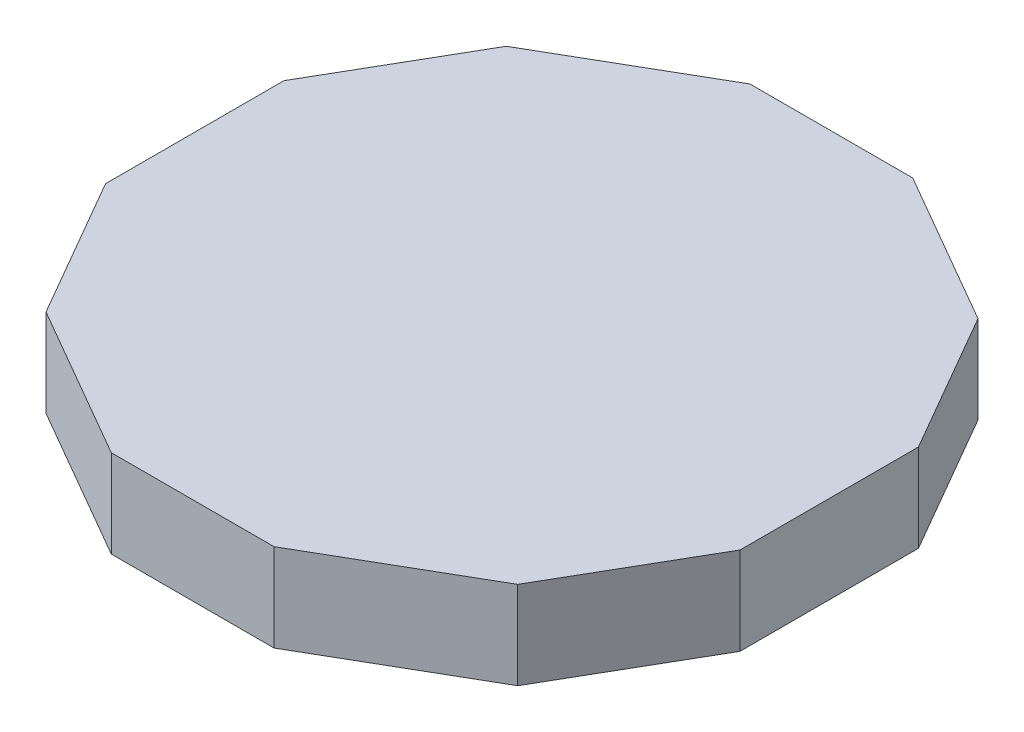
ISO-10303-21;
HEADER;
FILE_DESCRIPTION(('STEP AP214'),'2;1');
FILE_NAME('part.step','',(''),(''),'','','');
FILE_SCHEMA(('AUTOMOTIVE_DESIGN { 1 0 10303 214 1 1 1 1 }'));
ENDSEC;
DATA;
#1=APPLICATION_CONTEXT('core data for automotive mechanical design processes');
#2=APPLICATION_PROTOCOL_DEFINITION('international standard','automotive_design',2000,#1);
#3=PRODUCT_CONTEXT('',#1,'mechanical');
#4=PRODUCT('Part','Part','',(#3));
#5=PRODUCT_RELATED_PRODUCT_CATEGORY('part','',(#4));
#6=PRODUCT_DEFINITION_FORMATION('','',#4);
#7=PRODUCT_DEFINITION_CONTEXT('part definition',#1,'design');
#8=PRODUCT_DEFINITION('design','',#6,#7);
#9=PRODUCT_DEFINITION_SHAPE('','',#8);
#10=(LENGTH_UNIT() NAMED_UNIT(*) SI_UNIT(.MILLI.,.METRE.));
#11=(NAMED_UNIT(*) PLANE_ANGLE_UNIT() SI_UNIT($,.RADIAN.));
#12=(NAMED_UNIT(*) SI_UNIT($,.STERADIAN.) SOLID_ANGLE_UNIT());
#13=UNCERTAINTY_MEASURE_WITH_UNIT(LENGTH_MEASURE(1.E-05),#10,'distance_accuracy_value','');
#14=(GEOMETRIC_REPRESENTATION_CONTEXT(3) GLOBAL_UNCERTAINTY_ASSIGNED_CONTEXT((#13)) GLOBAL_UNIT_ASSIGNED_CONTEXT((#10,
#11,#12)) REPRESENTATION_CONTEXT('',''));
#15=CARTESIAN_POINT('',(0.,0.,0.));
#16=DIRECTION('',(0.,0.,1.));
#17=DIRECTION('',(1.,0.,0.));
#18=AXIS2_PLACEMENT_3D('',#15,#16,#17);
#19=CARTESIAN_POINT('',(144.544252848814,80.,-250.357989876229));
#20=DIRECTION('',(0.499999999999999,0.,-0.866025403784439));
#21=DIRECTION('',(-0.866025403784439,0.,-0.499999999999999));
#22=AXIS2_PLACEMENT_3D('',#19,#20,#21);
#23=PLANE('',#22);
#24=DIRECTION('',(0.866025403784439,0.,0.499999999999999));
#25=VECTOR('',#24,1.);
#26=CARTESIAN_POINT('',(144.544252848814,0.,-250.357989876229));
#27=LINE('',#26,#25);
#28=CARTESIAN_POINT('',(74.1502263927762,0.,-290.999999999964));
#29=VERTEX_POINT('',#28);
#30=CARTESIAN_POINT('',(214.938279304912,0.,-209.715979752459));
#31=VERTEX_POINT('',#30);
#32=EDGE_CURVE('E153',#29,#31,#27,.T.);
#33=ORIENTED_EDGE('',*,*,#32,.F.);
#34=DIRECTION('',(0.,-1.,0.));
#35=VECTOR('',#34,1.);
#36=CARTESIAN_POINT('',(74.1502263927762,80.,-290.999999999964));
#37=LINE('',#36,#35);
#38=CARTESIAN_POINT('',(74.1502263927762,80.,-290.999999999964));
#39=VERTEX_POINT('',#38);
#40=EDGE_CURVE('E11',#39,#29,#37,.T.);
#41=ORIENTED_EDGE('',*,*,#40,.F.);
#42=DIRECTION('',(0.866025403784439,0.,0.499999999999999));
#43=VECTOR('',#42,1.);
#44=CARTESIAN_POINT('',(144.544252848814,80.,-250.357989876229));
#45=LINE('',#44,#43);
#46=CARTESIAN_POINT('',(214.938279304912,80.,-209.715979752459));
#47=VERTEX_POINT('',#46);
#48=EDGE_CURVE('E185',#39,#47,#45,.T.);
#49=ORIENTED_EDGE('',*,*,#48,.T.);
#50=DIRECTION('',(0.,-1.,0.));
#51=VECTOR('',#50,1.);
#52=CARTESIAN_POINT('',(214.938279304912,80.,-209.715979752459));
#53=LINE('',#52,#51);
#54=EDGE_CURVE('E98',#47,#31,#53,.T.);
#55=ORIENTED_EDGE('',*,*,#54,.T.);
#56=EDGE_LOOP('',(#33,#41,#49,#55));
#57=FACE_BOUND('',#56,.T.);
#58=ADVANCED_FACE('F36',(#57),#23,.T.);
#59=CARTESIAN_POINT('',(-8.52353210739473E-11,80.,-290.999999999942));
#60=DIRECTION('',(2.92904883415685E-13,0.,1.));
#61=DIRECTION('',(1.,0.,-2.92904883415685E-13));
#62=AXIS2_PLACEMENT_3D('',#59,#60,#61);
#63=PLANE('',#62);
#64=DIRECTION('',(-1.,0.,2.92904883415685E-13));
#65=VECTOR('',#64,1.);
#66=CARTESIAN_POINT('',(-8.52353210739473E-11,0.,-290.999999999942));
#67=LINE('',#66,#65);
#68=CARTESIAN_POINT('',(-74.1502263928213,0.,-290.99999999992));
#69=VERTEX_POINT('',#68);
#70=EDGE_CURVE('E156',#29,#69,#67,.T.);
#71=ORIENTED_EDGE('',*,*,#70,.T.);
#72=DIRECTION('',(0.,-1.,0.));
#73=VECTOR('',#72,1.);
#74=CARTESIAN_POINT('',(-74.1502263928213,80.,-290.99999999992));
#75=LINE('',#74,#73);
#76=CARTESIAN_POINT('',(-74.1502263928213,80.,-290.99999999992));
#77=VERTEX_POINT('',#76);
#78=EDGE_CURVE('E44',#77,#69,#75,.T.);
#79=ORIENTED_EDGE('',*,*,#78,.F.);
#80=DIRECTION('',(-1.,0.,2.92904883415685E-13));
#81=VECTOR('',#80,1.);
#82=CARTESIAN_POINT('',(-8.52353210739473E-11,80.,-290.999999999942));
#83=LINE('',#82,#81);
#84=EDGE_CURVE('E224',#39,#77,#83,.T.);
#85=ORIENTED_EDGE('',*,*,#84,.F.);
#86=ORIENTED_EDGE('',*,*,#40,.T.);
#87=EDGE_LOOP('',(#71,#79,#85,#86));
#88=FACE_BOUND('',#87,.T.);
#89=ADVANCED_FACE('F209',(#88),#63,.F.);
#90=CARTESIAN_POINT('',(-144.544252848796,80.,-250.357989876227));
#91=DIRECTION('',(-0.499999999999954,0.,-0.866025403784465));
#92=DIRECTION('',(-0.866025403784465,0.,0.499999999999954));
#93=AXIS2_PLACEMENT_3D('',#90,#91,#92);
#94=PLANE('',#93);
#95=DIRECTION('',(0.866025403784465,0.,-0.499999999999954));
#96=VECTOR('',#95,1.);
#97=CARTESIAN_POINT('',(-144.544252848796,0.,-250.357989876227));
#98=LINE('',#97,#96);
#99=CARTESIAN_POINT('',(-214.938279304747,0.,-209.715979752546));
#100=VERTEX_POINT('',#99);
#101=EDGE_CURVE('E159',#100,#69,#98,.T.);
#102=ORIENTED_EDGE('',*,*,#101,.F.);
#103=DIRECTION('',(0.,-1.,0.));
#104=VECTOR('',#103,1.);
#105=CARTESIAN_POINT('',(-214.938279304747,80.,-209.715979752546));
#106=LINE('',#105,#104);
#107=CARTESIAN_POINT('',(-214.938279304747,80.,-209.715979752546));
#108=VERTEX_POINT('',#107);
#109=EDGE_CURVE('E199',#108,#100,#106,.T.);
#110=ORIENTED_EDGE('',*,*,#109,.F.);
#111=DIRECTION('',(0.866025403784465,0.,-0.499999999999954));
#112=VECTOR('',#111,1.);
#113=CARTESIAN_POINT('',(-144.544252848796,80.,-250.357989876227));
#114=LINE('',#113,#112);
#115=EDGE_CURVE('E206',#108,#77,#114,.T.);
#116=ORIENTED_EDGE('',*,*,#115,.T.);
#117=ORIENTED_EDGE('',*,*,#78,.T.);
#118=EDGE_LOOP('',(#102,#110,#116,#117));
#119=FACE_BOUND('',#118,.T.);
#120=ADVANCED_FACE('F204',(#119),#94,.T.);
#121=CARTESIAN_POINT('',(-252.013392501187,80.,-145.49999999994));
#122=DIRECTION('',(0.866025403784455,0.,0.499999999999972));
#123=DIRECTION('',(0.499999999999972,0.,-0.866025403784455));
#124=AXIS2_PLACEMENT_3D('',#121,#122,#123);
#125=PLANE('',#124);
#126=DIRECTION('',(-0.499999999999972,0.,0.866025403784455));
#127=VECTOR('',#126,1.);
#128=CARTESIAN_POINT('',(-252.013392501187,0.,-145.49999999994));
#129=LINE('',#128,#127);
#130=CARTESIAN_POINT('',(-289.08850569761,0.,-81.2840202473643));
#131=VERTEX_POINT('',#130);
#132=EDGE_CURVE('E162',#100,#131,#129,.T.);
#133=ORIENTED_EDGE('',*,*,#132,.T.);
#134=DIRECTION('',(0.,-1.,0.));
#135=VECTOR('',#134,1.);
#136=CARTESIAN_POINT('',(-289.08850569761,80.,-81.2840202473643));
#137=LINE('',#136,#135);
#138=CARTESIAN_POINT('',(-289.08850569761,80.,-81.2840202473643));
#139=VERTEX_POINT('',#138);
#140=EDGE_CURVE('E197',#139,#131,#137,.T.);
#141=ORIENTED_EDGE('',*,*,#140,.F.);
#142=DIRECTION('',(-0.499999999999972,0.,0.866025403784455));
#143=VECTOR('',#142,1.);
#144=CARTESIAN_POINT('',(-252.013392501187,80.,-145.49999999994));
#145=LINE('',#144,#143);
#146=EDGE_CURVE('E220',#108,#139,#145,.T.);
#147=ORIENTED_EDGE('',*,*,#146,.F.);
#148=ORIENTED_EDGE('',*,*,#109,.T.);
#149=EDGE_LOOP('',(#133,#141,#147,#148));
#150=FACE_BOUND('',#149,.T.);
#151=ADVANCED_FACE('F217',(#150),#125,.F.);
#152=CARTESIAN_POINT('',(-289.088505697611,80.,-5.33052085973939E-12));
#153=DIRECTION('',(-1.,0.,0.));
#154=DIRECTION('',(0.,0.,1.));
#155=AXIS2_PLACEMENT_3D('',#152,#153,#154);
#156=PLANE('',#155);
#157=DIRECTION('',(0.,0.,-1.));
#158=VECTOR('',#157,1.);
#159=CARTESIAN_POINT('',(-289.088505697611,0.,-5.33052085973939E-12));
#160=LINE('',#159,#158);
#161=CARTESIAN_POINT('',(-289.088505697613,0.,81.2840202475725));
#162=VERTEX_POINT('',#161);
#163=EDGE_CURVE('E165',#162,#131,#160,.T.);
#164=ORIENTED_EDGE('',*,*,#163,.F.);
#165=DIRECTION('',(0.,-1.,0.));
#166=VECTOR('',#165,1.);
#167=CARTESIAN_POINT('',(-289.088505697613,80.,81.2840202475725));
#168=LINE('',#167,#166);
#169=CARTESIAN_POINT('',(-289.088505697613,80.,81.2840202475725));
#170=VERTEX_POINT('',#169);
#171=EDGE_CURVE('E195',#170,#162,#168,.T.);
#172=ORIENTED_EDGE('',*,*,#171,.F.);
#173=DIRECTION('',(0.,0.,-1.));
#174=VECTOR('',#173,1.);
#175=CARTESIAN_POINT('',(-289.088505697611,80.,-5.33052085973939E-12));
#176=LINE('',#175,#174);
#177=EDGE_CURVE('E222',#170,#139,#176,.T.);
#178=ORIENTED_EDGE('',*,*,#177,.T.);
#179=ORIENTED_EDGE('',*,*,#140,.T.);
#180=EDGE_LOOP('',(#164,#172,#178,#179));
#181=FACE_BOUND('',#180,.T.);
#182=ADVANCED_FACE('F253',(#181),#156,.T.);
#183=CARTESIAN_POINT('',(-252.013392501266,80.,145.500000000008));
#184=DIRECTION('',(0.866025403784422,0.,-0.500000000000028));
#185=DIRECTION('',(-0.500000000000028,0.,-0.866025403784422));
#186=AXIS2_PLACEMENT_3D('',#183,#184,#185);
#187=PLANE('',#186);
#188=DIRECTION('',(0.500000000000028,0.,0.866025403784422));
#189=VECTOR('',#188,1.);
#190=CARTESIAN_POINT('',(-252.013392501266,0.,145.500000000008));
#191=LINE('',#190,#189);
#192=CARTESIAN_POINT('',(-214.938279304919,0.,209.715979752444));
#193=VERTEX_POINT('',#192);
#194=EDGE_CURVE('E168',#162,#193,#191,.T.);
#195=ORIENTED_EDGE('',*,*,#194,.T.);
#196=DIRECTION('',(0.,-1.,0.));
#197=VECTOR('',#196,1.);
#198=CARTESIAN_POINT('',(-214.938279304919,80.,209.715979752444));
#199=LINE('',#198,#197);
#200=CARTESIAN_POINT('',(-214.938279304919,80.,209.715979752444));
#201=VERTEX_POINT('',#200);
#202=EDGE_CURVE('E193',#201,#193,#199,.T.);
#203=ORIENTED_EDGE('',*,*,#202,.F.);
#204=DIRECTION('',(0.500000000000028,0.,0.866025403784422));
#205=VECTOR('',#204,1.);
#206=CARTESIAN_POINT('',(-252.013392501266,80.,145.500000000008));
#207=LINE('',#206,#205);
#208=EDGE_CURVE('E230',#170,#201,#207,.T.);
#209=ORIENTED_EDGE('',*,*,#208,.F.);
#210=ORIENTED_EDGE('',*,*,#171,.T.);
#211=EDGE_LOOP('',(#195,#203,#209,#210));
#212=FACE_BOUND('',#211,.T.);
#213=ADVANCED_FACE('F256',(#212),#187,.F.);
#214=CARTESIAN_POINT('',(-144.544252848814,80.,250.357989876219));
#215=DIRECTION('',(-0.500000000000015,0.,0.86602540378443));
#216=DIRECTION('',(0.86602540378443,0.,0.500000000000015));
#217=AXIS2_PLACEMENT_3D('',#214,#215,#216);
#218=PLANE('',#217);
#219=DIRECTION('',(-0.86602540378443,0.,-0.500000000000015));
#220=VECTOR('',#219,1.);
#221=CARTESIAN_POINT('',(-144.544252848814,0.,250.357989876219));
#222=LINE('',#221,#220);
#223=CARTESIAN_POINT('',(-74.1502263925754,0.,291.000000000072));
#224=VERTEX_POINT('',#223);
#225=EDGE_CURVE('E171',#224,#193,#222,.T.);
#226=ORIENTED_EDGE('',*,*,#225,.F.);
#227=DIRECTION('',(0.,-1.,0.));
#228=VECTOR('',#227,1.);
#229=CARTESIAN_POINT('',(-74.1502263925754,80.,291.000000000072));
#230=LINE('',#229,#228);
#231=CARTESIAN_POINT('',(-74.1502263925754,80.,291.000000000072));
#232=VERTEX_POINT('',#231);
#233=EDGE_CURVE('E191',#232,#224,#230,.T.);
#234=ORIENTED_EDGE('',*,*,#233,.F.);
#235=DIRECTION('',(-0.86602540378443,0.,-0.500000000000015));
#236=VECTOR('',#235,1.);
#237=CARTESIAN_POINT('',(-144.544252848814,80.,250.357989876219));
#238=LINE('',#237,#236);
#239=EDGE_CURVE('E232',#232,#201,#238,.T.);
#240=ORIENTED_EDGE('',*,*,#239,.T.);
#241=ORIENTED_EDGE('',*,*,#202,.T.);
#242=EDGE_LOOP('',(#226,#234,#240,#241));
#243=FACE_BOUND('',#242,.T.);
#244=ADVANCED_FACE('F260',(#243),#218,.T.);
#245=CARTESIAN_POINT('',(1.10810724802906E-10,80.,291.000000000043));
#246=DIRECTION('',(-3.80792868738451E-13,0.,-1.));
#247=DIRECTION('',(-1.,0.,3.80792868738451E-13));
#248=AXIS2_PLACEMENT_3D('',#245,#246,#247);
#249=PLANE('',#248);
#250=DIRECTION('',(1.,0.,-3.80792868738451E-13));
#251=VECTOR('',#250,1.);
#252=CARTESIAN_POINT('',(1.10810724802906E-10,0.,291.000000000043));
#253=LINE('',#252,#251);
#254=CARTESIAN_POINT('',(74.1502263926917,0.,291.000000000015));
#255=VERTEX_POINT('',#254);
#256=EDGE_CURVE('E174',#224,#255,#253,.T.);
#257=ORIENTED_EDGE('',*,*,#256,.T.);
#258=DIRECTION('',(0.,-1.,0.));
#259=VECTOR('',#258,1.);
#260=CARTESIAN_POINT('',(74.1502263926917,80.,291.000000000015));
#261=LINE('',#260,#259);
#262=CARTESIAN_POINT('',(74.1502263926917,80.,291.000000000015));
#263=VERTEX_POINT('',#262);
#264=EDGE_CURVE('E189',#263,#255,#261,.T.);
#265=ORIENTED_EDGE('',*,*,#264,.F.);
#266=DIRECTION('',(1.,0.,-3.80792868738451E-13));
#267=VECTOR('',#266,1.);
#268=CARTESIAN_POINT('',(1.10810724802906E-10,80.,291.000000000043));
#269=LINE('',#268,#267);
#270=EDGE_CURVE('E235',#232,#263,#269,.T.);
#271=ORIENTED_EDGE('',*,*,#270,.F.);
#272=ORIENTED_EDGE('',*,*,#233,.T.);
#273=EDGE_LOOP('',(#257,#265,#271,#272));
#274=FACE_BOUND('',#273,.T.);
#275=ADVANCED_FACE('F264',(#274),#249,.F.);
#276=CARTESIAN_POINT('',(144.544252848812,80.,250.357989876235));
#277=DIRECTION('',(0.499999999999984,0.,0.866025403784448));
#278=DIRECTION('',(0.866025403784448,0.,-0.499999999999984));
#279=AXIS2_PLACEMENT_3D('',#276,#277,#278);
#280=PLANE('',#279);
#281=DIRECTION('',(-0.866025403784448,0.,0.499999999999984));
#282=VECTOR('',#281,1.);
#283=CARTESIAN_POINT('',(144.544252848812,0.,250.357989876235));
#284=LINE('',#283,#282);
#285=CARTESIAN_POINT('',(214.938279304861,0.,209.715979752494));
#286=VERTEX_POINT('',#285);
#287=EDGE_CURVE('E177',#286,#255,#284,.T.);
#288=ORIENTED_EDGE('',*,*,#287,.F.);
#289=DIRECTION('',(0.,-1.,0.));
#290=VECTOR('',#289,1.);
#291=CARTESIAN_POINT('',(214.938279304861,80.,209.715979752494));
#292=LINE('',#291,#290);
#293=CARTESIAN_POINT('',(214.938279304861,80.,209.715979752494));
#294=VERTEX_POINT('',#293);
#295=EDGE_CURVE('E146',#294,#286,#292,.T.);
#296=ORIENTED_EDGE('',*,*,#295,.F.);
#297=DIRECTION('',(-0.866025403784448,0.,0.499999999999984));
#298=VECTOR('',#297,1.);
#299=CARTESIAN_POINT('',(144.544252848812,80.,250.357989876235));
#300=LINE('',#299,#298);
#301=EDGE_CURVE('E135',#294,#263,#300,.T.);
#302=ORIENTED_EDGE('',*,*,#301,.T.);
#303=ORIENTED_EDGE('',*,*,#264,.T.);
#304=EDGE_LOOP('',(#288,#296,#302,#303));
#305=FACE_BOUND('',#304,.T.);
#306=ADVANCED_FACE('F238',(#305),#280,.T.);
#307=CARTESIAN_POINT('',(252.013392501232,80.,145.500000000041));
#308=DIRECTION('',(-0.866025403784344,0.,-0.500000000000165));
#309=DIRECTION('',(-0.500000000000165,0.,0.866025403784344));
#310=AXIS2_PLACEMENT_3D('',#307,#308,#309);
#311=PLANE('',#310);
#312=DIRECTION('',(0.500000000000165,0.,-0.866025403784344));
#313=VECTOR('',#312,1.);
#314=CARTESIAN_POINT('',(252.013392501232,0.,145.500000000041));
#315=LINE('',#314,#313);
#316=CARTESIAN_POINT('',(289.088505697634,0.,81.284020247533));
#317=VERTEX_POINT('',#316);
#318=EDGE_CURVE('E142',#286,#317,#315,.T.);
#319=ORIENTED_EDGE('',*,*,#318,.T.);
#320=DIRECTION('',(0.,-1.,0.));
#321=VECTOR('',#320,1.);
#322=CARTESIAN_POINT('',(289.088505697634,80.,81.284020247533));
#323=LINE('',#322,#321);
#324=CARTESIAN_POINT('',(289.088505697634,80.,81.284020247533));
#325=VERTEX_POINT('',#324);
#326=EDGE_CURVE('E139',#325,#317,#323,.T.);
#327=ORIENTED_EDGE('',*,*,#326,.F.);
#328=DIRECTION('',(0.500000000000165,0.,-0.866025403784344));
#329=VECTOR('',#328,1.);
#330=CARTESIAN_POINT('',(252.013392501232,80.,145.500000000041));
#331=LINE('',#330,#329);
#332=EDGE_CURVE('E129',#294,#325,#331,.T.);
#333=ORIENTED_EDGE('',*,*,#332,.F.);
#334=ORIENTED_EDGE('',*,*,#295,.T.);
#335=EDGE_LOOP('',(#319,#327,#333,#334));
#336=FACE_BOUND('',#335,.T.);
#337=ADVANCED_FACE('F140',(#336),#311,.F.);
#338=CARTESIAN_POINT('',(289.088505697634,80.,0.));
#339=DIRECTION('',(1.,0.,0.));
#340=DIRECTION('',(0.,0.,-1.));
#341=AXIS2_PLACEMENT_3D('',#338,#339,#340);
#342=PLANE('',#341);
#343=DIRECTION('',(0.,0.,1.));
#344=VECTOR('',#343,1.);
#345=CARTESIAN_POINT('',(289.088505697634,0.,0.));
#346=LINE('',#345,#344);
#347=CARTESIAN_POINT('',(289.088505697634,0.,-81.2840202475394));
#348=VERTEX_POINT('',#347);
#349=EDGE_CURVE('E181',#348,#317,#346,.T.);
#350=ORIENTED_EDGE('',*,*,#349,.F.);
#351=DIRECTION('',(0.,-1.,0.));
#352=VECTOR('',#351,1.);
#353=CARTESIAN_POINT('',(289.088505697634,80.,-81.2840202475394));
#354=LINE('',#353,#352);
#355=CARTESIAN_POINT('',(289.088505697634,80.,-81.2840202475394));
#356=VERTEX_POINT('',#355);
#357=EDGE_CURVE('E91',#356,#348,#354,.T.);
#358=ORIENTED_EDGE('',*,*,#357,.F.);
#359=DIRECTION('',(0.,0.,1.));
#360=VECTOR('',#359,1.);
#361=CARTESIAN_POINT('',(289.088505697634,80.,0.));
#362=LINE('',#361,#360);
#363=EDGE_CURVE('E133',#356,#325,#362,.T.);
#364=ORIENTED_EDGE('',*,*,#363,.T.);
#365=ORIENTED_EDGE('',*,*,#326,.T.);
#366=EDGE_LOOP('',(#350,#358,#364,#365));
#367=FACE_BOUND('',#366,.T.);
#368=ADVANCED_FACE('F148',(#367),#342,.T.);
#369=CARTESIAN_POINT('',(252.013392501268,80.,-145.500000000009));
#370=DIRECTION('',(-0.866025403784423,0.,0.500000000000028));
#371=DIRECTION('',(0.500000000000028,0.,0.866025403784423));
#372=AXIS2_PLACEMENT_3D('',#369,#370,#371);
#373=PLANE('',#372);
#374=DIRECTION('',(-0.500000000000028,0.,-0.866025403784423));
#375=VECTOR('',#374,1.);
#376=CARTESIAN_POINT('',(252.013392501268,0.,-145.500000000009));
#377=LINE('',#376,#375);
#378=EDGE_CURVE('E183',#348,#31,#377,.T.);
#379=ORIENTED_EDGE('',*,*,#378,.T.);
#380=ORIENTED_EDGE('',*,*,#54,.F.);
#381=DIRECTION('',(-0.500000000000028,0.,-0.866025403784423));
#382=VECTOR('',#381,1.);
#383=CARTESIAN_POINT('',(252.013392501268,80.,-145.500000000009));
#384=LINE('',#383,#382);
#385=EDGE_CURVE('E52',#356,#47,#384,.T.);
#386=ORIENTED_EDGE('',*,*,#385,.F.);
#387=ORIENTED_EDGE('',*,*,#357,.T.);
#388=EDGE_LOOP('',(#379,#380,#386,#387));
#389=FACE_BOUND('',#388,.T.);
#390=ADVANCED_FACE('F241',(#389),#373,.F.);
#391=CARTESIAN_POINT('',(0.,80.,0.));
#392=DIRECTION('',(0.,1.,0.));
#393=DIRECTION('',(0.,0.,1.));
#394=AXIS2_PLACEMENT_3D('',#391,#392,#393);
#395=PLANE('',#394);
#396=ORIENTED_EDGE('',*,*,#48,.F.);
#397=ORIENTED_EDGE('',*,*,#84,.T.);
#398=ORIENTED_EDGE('',*,*,#115,.F.);
#399=ORIENTED_EDGE('',*,*,#146,.T.);
#400=ORIENTED_EDGE('',*,*,#177,.F.);
#401=ORIENTED_EDGE('',*,*,#208,.T.);
#402=ORIENTED_EDGE('',*,*,#239,.F.);
#403=ORIENTED_EDGE('',*,*,#270,.T.);
#404=ORIENTED_EDGE('',*,*,#301,.F.);
#405=ORIENTED_EDGE('',*,*,#332,.T.);
#406=ORIENTED_EDGE('',*,*,#363,.F.);
#407=ORIENTED_EDGE('',*,*,#385,.T.);
#408=EDGE_LOOP('',(#396,#397,#398,#399,#400,#401,#402,#403,#404,#405,#406,#407));
#409=FACE_BOUND('',#408,.T.);
#410=ADVANCED_FACE('F131',(#409),#395,.T.);
#411=CARTESIAN_POINT('',(0.,0.,0.));
#412=DIRECTION('',(0.,1.,0.));
#413=DIRECTION('',(0.,0.,1.));
#414=AXIS2_PLACEMENT_3D('',#411,#412,#413);
#415=PLANE('',#414);
#416=ORIENTED_EDGE('',*,*,#32,.T.);
#417=ORIENTED_EDGE('',*,*,#378,.F.);
#418=ORIENTED_EDGE('',*,*,#349,.T.);
#419=ORIENTED_EDGE('',*,*,#318,.F.);
#420=ORIENTED_EDGE('',*,*,#287,.T.);
#421=ORIENTED_EDGE('',*,*,#256,.F.);
#422=ORIENTED_EDGE('',*,*,#225,.T.);
#423=ORIENTED_EDGE('',*,*,#194,.F.);
#424=ORIENTED_EDGE('',*,*,#163,.T.);
#425=ORIENTED_EDGE('',*,*,#132,.F.);
#426=ORIENTED_EDGE('',*,*,#101,.T.);
#427=ORIENTED_EDGE('',*,*,#70,.F.);
#428=EDGE_LOOP('',(#416,#417,#418,#419,#420,#421,#422,#423,#424,#425,#426,#427));
#429=FACE_BOUND('',#428,.T.);
#430=ADVANCED_FACE('F212',(#429),#415,.F.);
#431=CLOSED_SHELL('',(#58,#89,#120,#151,#182,#213,#244,#275,#306,#337,#368,#390,#410,#430));
#432=MANIFOLD_SOLID_BREP('B2',#431);
#433=ADVANCED_BREP_SHAPE_REPRESENTATION('',(#18,#432),#14);
#434=SHAPE_DEFINITION_REPRESENTATION(#9,#433);
ENDSEC;
END-ISO-10303-21;
